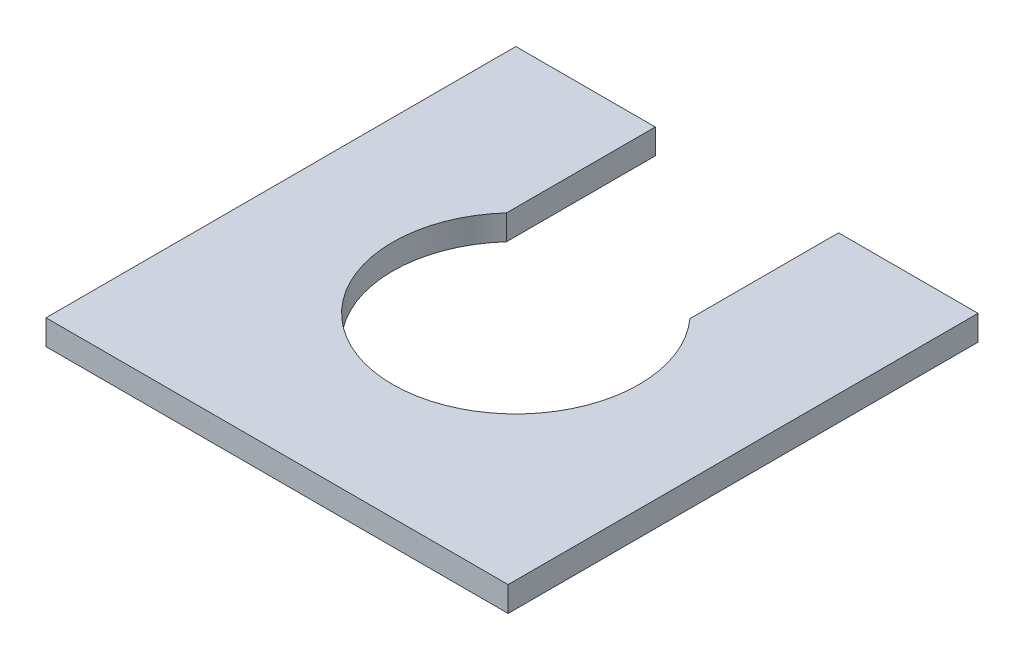
ISO-10303-21;
HEADER;
FILE_DESCRIPTION(('STEP AP214'),'2;1');
FILE_NAME('part.step','',(''),(''),'','','');
FILE_SCHEMA(('AUTOMOTIVE_DESIGN { 1 0 10303 214 1 1 1 1 }'));
ENDSEC;
DATA;
#1=APPLICATION_CONTEXT('core data for automotive mechanical design processes');
#2=APPLICATION_PROTOCOL_DEFINITION('international standard','automotive_design',2000,#1);
#3=PRODUCT_CONTEXT('',#1,'mechanical');
#4=PRODUCT('Part','Part','',(#3));
#5=PRODUCT_RELATED_PRODUCT_CATEGORY('part','',(#4));
#6=PRODUCT_DEFINITION_FORMATION('','',#4);
#7=PRODUCT_DEFINITION_CONTEXT('part definition',#1,'design');
#8=PRODUCT_DEFINITION('design','',#6,#7);
#9=PRODUCT_DEFINITION_SHAPE('','',#8);
#10=(LENGTH_UNIT() NAMED_UNIT(*) SI_UNIT(.MILLI.,.METRE.));
#11=(NAMED_UNIT(*) PLANE_ANGLE_UNIT() SI_UNIT($,.RADIAN.));
#12=(NAMED_UNIT(*) SI_UNIT($,.STERADIAN.) SOLID_ANGLE_UNIT());
#13=UNCERTAINTY_MEASURE_WITH_UNIT(LENGTH_MEASURE(1.E-05),#10,'distance_accuracy_value','');
#14=(GEOMETRIC_REPRESENTATION_CONTEXT(3) GLOBAL_UNCERTAINTY_ASSIGNED_CONTEXT((#13)) GLOBAL_UNIT_ASSIGNED_CONTEXT((#10,
#11,#12)) REPRESENTATION_CONTEXT('',''));
#15=CARTESIAN_POINT('',(0.,0.,0.));
#16=DIRECTION('',(0.,0.,1.));
#17=DIRECTION('',(1.,0.,0.));
#18=AXIS2_PLACEMENT_3D('',#15,#16,#17);
#19=CARTESIAN_POINT('',(1.69180000000001,1.3625,9.1012));
#20=DIRECTION('',(0.,1.,0.));
#21=DIRECTION('',(0.,0.,1.));
#22=AXIS2_PLACEMENT_3D('',#19,#20,#21);
#23=PLANE('',#22);
#24=DIRECTION('',(1.,0.,0.));
#25=VECTOR('',#24,1.);
#26=CARTESIAN_POINT('',(1.69180000000001,1.3625,8.795));
#27=LINE('',#26,#25);
#28=CARTESIAN_POINT('',(4.99300000000001,1.3625,8.795));
#29=VERTEX_POINT('',#28);
#30=CARTESIAN_POINT('',(1.99300000000001,1.3625,8.795));
#31=VERTEX_POINT('',#30);
#32=EDGE_CURVE('E120',#29,#31,#27,.F.);
#33=ORIENTED_EDGE('',*,*,#32,.F.);
#34=DIRECTION('',(0.,0.,-1.));
#35=VECTOR('',#34,1.);
#36=CARTESIAN_POINT('',(4.99300000000001,1.3625,5.4388));
#37=LINE('',#36,#35);
#38=CARTESIAN_POINT('',(4.99300000000001,1.3625,5.745));
#39=VERTEX_POINT('',#38);
#40=EDGE_CURVE('E125',#39,#29,#37,.F.);
#41=ORIENTED_EDGE('',*,*,#40,.F.);
#42=DIRECTION('',(-1.,0.,0.));
#43=VECTOR('',#42,1.);
#44=CARTESIAN_POINT('',(3.39630000000001,1.3625,5.745));
#45=LINE('',#44,#43);
#46=CARTESIAN_POINT('',(4.08800000000001,1.3625,5.745));
#47=VERTEX_POINT('',#46);
#48=EDGE_CURVE('E93',#47,#39,#45,.F.);
#49=ORIENTED_EDGE('',*,*,#48,.F.);
#50=DIRECTION('',(0.,0.,1.));
#51=VECTOR('',#50,1.);
#52=CARTESIAN_POINT('',(4.08800000000001,1.3625,7.4079570654908));
#53=LINE('',#52,#51);
#54=CARTESIAN_POINT('',(4.08800000000001,1.3625,6.71023369590071));
#55=VERTEX_POINT('',#54);
#56=EDGE_CURVE('E90',#55,#47,#53,.F.);
#57=ORIENTED_EDGE('',*,*,#56,.F.);
#58=CARTESIAN_POINT('',(3.49300000000001,1.3625,7.245));
#59=DIRECTION('',(0.,1.,0.));
#60=DIRECTION('',(0.,0.,1.));
#61=AXIS2_PLACEMENT_3D('',#58,#59,#60);
#62=CIRCLE('',#61,0.799999999999998);
#63=CARTESIAN_POINT('',(2.89800000000001,1.3625,6.71023369590071));
#64=VERTEX_POINT('',#63);
#65=EDGE_CURVE('E20',#55,#64,#62,.F.);
#66=ORIENTED_EDGE('',*,*,#65,.T.);
#67=DIRECTION('',(0.,0.,1.));
#68=VECTOR('',#67,1.);
#69=CARTESIAN_POINT('',(2.89800000000001,1.3625,9.1012));
#70=LINE('',#69,#68);
#71=CARTESIAN_POINT('',(2.89800000000001,1.3625,5.745));
#72=VERTEX_POINT('',#71);
#73=EDGE_CURVE('E113',#64,#72,#70,.F.);
#74=ORIENTED_EDGE('',*,*,#73,.T.);
#75=DIRECTION('',(1.,0.,0.));
#76=VECTOR('',#75,1.);
#77=CARTESIAN_POINT('',(1.69180000000001,1.3625,5.745));
#78=LINE('',#77,#76);
#79=CARTESIAN_POINT('',(1.99300000000001,1.3625,5.745));
#80=VERTEX_POINT('',#79);
#81=EDGE_CURVE('E88',#72,#80,#78,.F.);
#82=ORIENTED_EDGE('',*,*,#81,.T.);
#83=DIRECTION('',(0.,0.,1.));
#84=VECTOR('',#83,1.);
#85=CARTESIAN_POINT('',(1.99300000000001,1.3625,9.1012));
#86=LINE('',#85,#84);
#87=EDGE_CURVE('E106',#31,#80,#86,.F.);
#88=ORIENTED_EDGE('',*,*,#87,.F.);
#89=EDGE_LOOP('',(#33,#41,#49,#57,#66,#74,#82,#88));
#90=FACE_BOUND('',#89,.T.);
#91=ADVANCED_FACE('F17',(#90),#23,.T.);
#92=CARTESIAN_POINT('',(3.49300000000001,1.28125,7.245));
#93=DIRECTION('',(0.,1.,0.));
#94=DIRECTION('',(0.,0.,1.));
#95=AXIS2_PLACEMENT_3D('',#92,#93,#94);
#96=CYLINDRICAL_SURFACE('',#95,0.799999999999998);
#97=DIRECTION('',(0.,1.,0.));
#98=VECTOR('',#97,1.);
#99=CARTESIAN_POINT('',(4.08800000000001,0.695275,6.7102336959007));
#100=LINE('',#99,#98);
#101=CARTESIAN_POINT('',(4.08800000000001,1.2,6.71023369590071));
#102=VERTEX_POINT('',#101);
#103=EDGE_CURVE('E82',#102,#55,#100,.T.);
#104=ORIENTED_EDGE('',*,*,#103,.F.);
#105=CARTESIAN_POINT('',(3.49300000000001,1.2,7.245));
#106=DIRECTION('',(0.,1.,0.));
#107=DIRECTION('',(0.,0.,1.));
#108=AXIS2_PLACEMENT_3D('',#105,#106,#107);
#109=CIRCLE('',#108,0.799999999999998);
#110=CARTESIAN_POINT('',(2.89800000000001,1.2,6.71023369590071));
#111=VERTEX_POINT('',#110);
#112=EDGE_CURVE('E135',#111,#102,#109,.T.);
#113=ORIENTED_EDGE('',*,*,#112,.F.);
#114=DIRECTION('',(0.,1.,0.));
#115=VECTOR('',#114,1.);
#116=CARTESIAN_POINT('',(2.89800000000001,0.695275,6.7102336959007));
#117=LINE('',#116,#115);
#118=EDGE_CURVE('E85',#64,#111,#117,.F.);
#119=ORIENTED_EDGE('',*,*,#118,.F.);
#120=ORIENTED_EDGE('',*,*,#65,.F.);
#121=EDGE_LOOP('',(#104,#113,#119,#120));
#122=FACE_BOUND('',#121,.T.);
#123=ADVANCED_FACE('F80',(#122),#96,.F.);
#124=CARTESIAN_POINT('',(4.08800000000001,0.695275,7.4079570654908));
#125=DIRECTION('',(-1.,0.,0.));
#126=DIRECTION('',(0.,0.,1.));
#127=AXIS2_PLACEMENT_3D('',#124,#125,#126);
#128=PLANE('',#127);
#129=ORIENTED_EDGE('',*,*,#56,.T.);
#130=DIRECTION('',(0.,1.,0.));
#131=VECTOR('',#130,1.);
#132=CARTESIAN_POINT('',(4.08800000000001,1.867225,5.745));
#133=LINE('',#132,#131);
#134=CARTESIAN_POINT('',(4.08800000000001,1.2,5.745));
#135=VERTEX_POINT('',#134);
#136=EDGE_CURVE('E131',#135,#47,#133,.T.);
#137=ORIENTED_EDGE('',*,*,#136,.F.);
#138=DIRECTION('',(0.,0.,-1.));
#139=VECTOR('',#138,1.);
#140=CARTESIAN_POINT('',(4.08800000000001,1.2,9.1012));
#141=LINE('',#140,#139);
#142=EDGE_CURVE('E99',#102,#135,#141,.T.);
#143=ORIENTED_EDGE('',*,*,#142,.F.);
#144=ORIENTED_EDGE('',*,*,#103,.T.);
#145=EDGE_LOOP('',(#129,#137,#143,#144));
#146=FACE_BOUND('',#145,.T.);
#147=ADVANCED_FACE('F97',(#146),#128,.T.);
#148=CARTESIAN_POINT('',(3.39630000000001,1.867225,5.745));
#149=DIRECTION('',(0.,0.,-1.));
#150=DIRECTION('',(-1.,0.,0.));
#151=AXIS2_PLACEMENT_3D('',#148,#149,#150);
#152=PLANE('',#151);
#153=DIRECTION('',(1.,0.,0.));
#154=VECTOR('',#153,1.);
#155=CARTESIAN_POINT('',(1.69180000000001,1.2,5.745));
#156=LINE('',#155,#154);
#157=CARTESIAN_POINT('',(4.99300000000001,1.2,5.745));
#158=VERTEX_POINT('',#157);
#159=EDGE_CURVE('E137',#135,#158,#156,.T.);
#160=ORIENTED_EDGE('',*,*,#159,.F.);
#161=ORIENTED_EDGE('',*,*,#136,.T.);
#162=ORIENTED_EDGE('',*,*,#48,.T.);
#163=DIRECTION('',(0.,1.,0.));
#164=VECTOR('',#163,1.);
#165=CARTESIAN_POINT('',(4.99300000000001,0.695275,5.745));
#166=LINE('',#165,#164);
#167=EDGE_CURVE('E127',#158,#39,#166,.T.);
#168=ORIENTED_EDGE('',*,*,#167,.F.);
#169=EDGE_LOOP('',(#160,#161,#162,#168));
#170=FACE_BOUND('',#169,.T.);
#171=ADVANCED_FACE('F187',(#170),#152,.T.);
#172=CARTESIAN_POINT('',(4.99300000000001,0.695275,5.4388));
#173=DIRECTION('',(1.,0.,0.));
#174=DIRECTION('',(0.,0.,-1.));
#175=AXIS2_PLACEMENT_3D('',#172,#173,#174);
#176=PLANE('',#175);
#177=DIRECTION('',(0.,1.,0.));
#178=VECTOR('',#177,1.);
#179=CARTESIAN_POINT('',(4.99300000000001,0.695275,8.795));
#180=LINE('',#179,#178);
#181=CARTESIAN_POINT('',(4.99300000000001,1.2,8.795));
#182=VERTEX_POINT('',#181);
#183=EDGE_CURVE('E122',#182,#29,#180,.T.);
#184=ORIENTED_EDGE('',*,*,#183,.F.);
#185=DIRECTION('',(0.,0.,-1.));
#186=VECTOR('',#185,1.);
#187=CARTESIAN_POINT('',(4.99300000000001,1.2,9.1012));
#188=LINE('',#187,#186);
#189=EDGE_CURVE('E167',#158,#182,#188,.F.);
#190=ORIENTED_EDGE('',*,*,#189,.F.);
#191=ORIENTED_EDGE('',*,*,#167,.T.);
#192=ORIENTED_EDGE('',*,*,#40,.T.);
#193=EDGE_LOOP('',(#184,#190,#191,#192));
#194=FACE_BOUND('',#193,.T.);
#195=ADVANCED_FACE('F209',(#194),#176,.T.);
#196=CARTESIAN_POINT('',(1.69180000000001,0.695275,8.795));
#197=DIRECTION('',(0.,0.,1.));
#198=DIRECTION('',(1.,0.,0.));
#199=AXIS2_PLACEMENT_3D('',#196,#197,#198);
#200=PLANE('',#199);
#201=DIRECTION('',(0.,1.,0.));
#202=VECTOR('',#201,1.);
#203=CARTESIAN_POINT('',(1.99300000000001,0.695275,8.795));
#204=LINE('',#203,#202);
#205=CARTESIAN_POINT('',(1.99300000000001,1.2,8.795));
#206=VERTEX_POINT('',#205);
#207=EDGE_CURVE('E110',#206,#31,#204,.T.);
#208=ORIENTED_EDGE('',*,*,#207,.F.);
#209=DIRECTION('',(1.,0.,0.));
#210=VECTOR('',#209,1.);
#211=CARTESIAN_POINT('',(1.69180000000001,1.2,8.795));
#212=LINE('',#211,#210);
#213=EDGE_CURVE('E158',#182,#206,#212,.F.);
#214=ORIENTED_EDGE('',*,*,#213,.F.);
#215=ORIENTED_EDGE('',*,*,#183,.T.);
#216=ORIENTED_EDGE('',*,*,#32,.T.);
#217=EDGE_LOOP('',(#208,#214,#215,#216));
#218=FACE_BOUND('',#217,.T.);
#219=ADVANCED_FACE('F205',(#218),#200,.T.);
#220=CARTESIAN_POINT('',(1.99300000000001,0.695275,9.1012));
#221=DIRECTION('',(-1.,0.,0.));
#222=DIRECTION('',(0.,0.,1.));
#223=AXIS2_PLACEMENT_3D('',#220,#221,#222);
#224=PLANE('',#223);
#225=DIRECTION('',(0.,1.,0.));
#226=VECTOR('',#225,1.);
#227=CARTESIAN_POINT('',(1.99300000000001,1.867225,5.745));
#228=LINE('',#227,#226);
#229=CARTESIAN_POINT('',(1.99300000000001,1.2,5.745));
#230=VERTEX_POINT('',#229);
#231=EDGE_CURVE('E109',#230,#80,#228,.T.);
#232=ORIENTED_EDGE('',*,*,#231,.F.);
#233=DIRECTION('',(0.,0.,-1.));
#234=VECTOR('',#233,1.);
#235=CARTESIAN_POINT('',(1.99300000000001,1.2,9.1012));
#236=LINE('',#235,#234);
#237=EDGE_CURVE('E149',#206,#230,#236,.T.);
#238=ORIENTED_EDGE('',*,*,#237,.F.);
#239=ORIENTED_EDGE('',*,*,#207,.T.);
#240=ORIENTED_EDGE('',*,*,#87,.T.);
#241=EDGE_LOOP('',(#232,#238,#239,#240));
#242=FACE_BOUND('',#241,.T.);
#243=ADVANCED_FACE('F202',(#242),#224,.T.);
#244=CARTESIAN_POINT('',(1.30130000000001,1.867225,5.745));
#245=DIRECTION('',(0.,0.,-1.));
#246=DIRECTION('',(-1.,0.,0.));
#247=AXIS2_PLACEMENT_3D('',#244,#245,#246);
#248=PLANE('',#247);
#249=ORIENTED_EDGE('',*,*,#81,.F.);
#250=DIRECTION('',(0.,1.,0.));
#251=VECTOR('',#250,1.);
#252=CARTESIAN_POINT('',(2.89800000000001,0.695275,5.745));
#253=LINE('',#252,#251);
#254=CARTESIAN_POINT('',(2.89800000000001,1.2,5.745));
#255=VERTEX_POINT('',#254);
#256=EDGE_CURVE('E35',#255,#72,#253,.T.);
#257=ORIENTED_EDGE('',*,*,#256,.F.);
#258=DIRECTION('',(1.,0.,0.));
#259=VECTOR('',#258,1.);
#260=CARTESIAN_POINT('',(1.69180000000001,1.2,5.745));
#261=LINE('',#260,#259);
#262=EDGE_CURVE('E26',#230,#255,#261,.T.);
#263=ORIENTED_EDGE('',*,*,#262,.F.);
#264=ORIENTED_EDGE('',*,*,#231,.T.);
#265=EDGE_LOOP('',(#249,#257,#263,#264));
#266=FACE_BOUND('',#265,.T.);
#267=ADVANCED_FACE('F197',(#266),#248,.T.);
#268=CARTESIAN_POINT('',(2.89800000000001,0.695275,5.0472766304099));
#269=DIRECTION('',(1.,0.,0.));
#270=DIRECTION('',(0.,0.,-1.));
#271=AXIS2_PLACEMENT_3D('',#268,#269,#270);
#272=PLANE('',#271);
#273=DIRECTION('',(0.,0.,-1.));
#274=VECTOR('',#273,1.);
#275=CARTESIAN_POINT('',(2.89800000000001,1.2,9.1012));
#276=LINE('',#275,#274);
#277=EDGE_CURVE('E11',#255,#111,#276,.F.);
#278=ORIENTED_EDGE('',*,*,#277,.F.);
#279=ORIENTED_EDGE('',*,*,#256,.T.);
#280=ORIENTED_EDGE('',*,*,#73,.F.);
#281=ORIENTED_EDGE('',*,*,#118,.T.);
#282=EDGE_LOOP('',(#278,#279,#280,#281));
#283=FACE_BOUND('',#282,.T.);
#284=ADVANCED_FACE('F191',(#283),#272,.T.);
#285=CARTESIAN_POINT('',(1.69180000000001,1.2,9.1012));
#286=DIRECTION('',(0.,-1.,0.));
#287=DIRECTION('',(0.,0.,-1.));
#288=AXIS2_PLACEMENT_3D('',#285,#286,#287);
#289=PLANE('',#288);
#290=ORIENTED_EDGE('',*,*,#262,.T.);
#291=ORIENTED_EDGE('',*,*,#277,.T.);
#292=ORIENTED_EDGE('',*,*,#112,.T.);
#293=ORIENTED_EDGE('',*,*,#142,.T.);
#294=ORIENTED_EDGE('',*,*,#159,.T.);
#295=ORIENTED_EDGE('',*,*,#189,.T.);
#296=ORIENTED_EDGE('',*,*,#213,.T.);
#297=ORIENTED_EDGE('',*,*,#237,.T.);
#298=EDGE_LOOP('',(#290,#291,#292,#293,#294,#295,#296,#297));
#299=FACE_BOUND('',#298,.T.);
#300=ADVANCED_FACE('F189',(#299),#289,.T.);
#301=CLOSED_SHELL('',(#91,#123,#147,#171,#195,#219,#243,#267,#284,#300));
#302=MANIFOLD_SOLID_BREP('B1',#301);
#303=ADVANCED_BREP_SHAPE_REPRESENTATION('',(#18,#302),#14);
#304=SHAPE_DEFINITION_REPRESENTATION(#9,#303);
ENDSEC;
END-ISO-10303-21;
